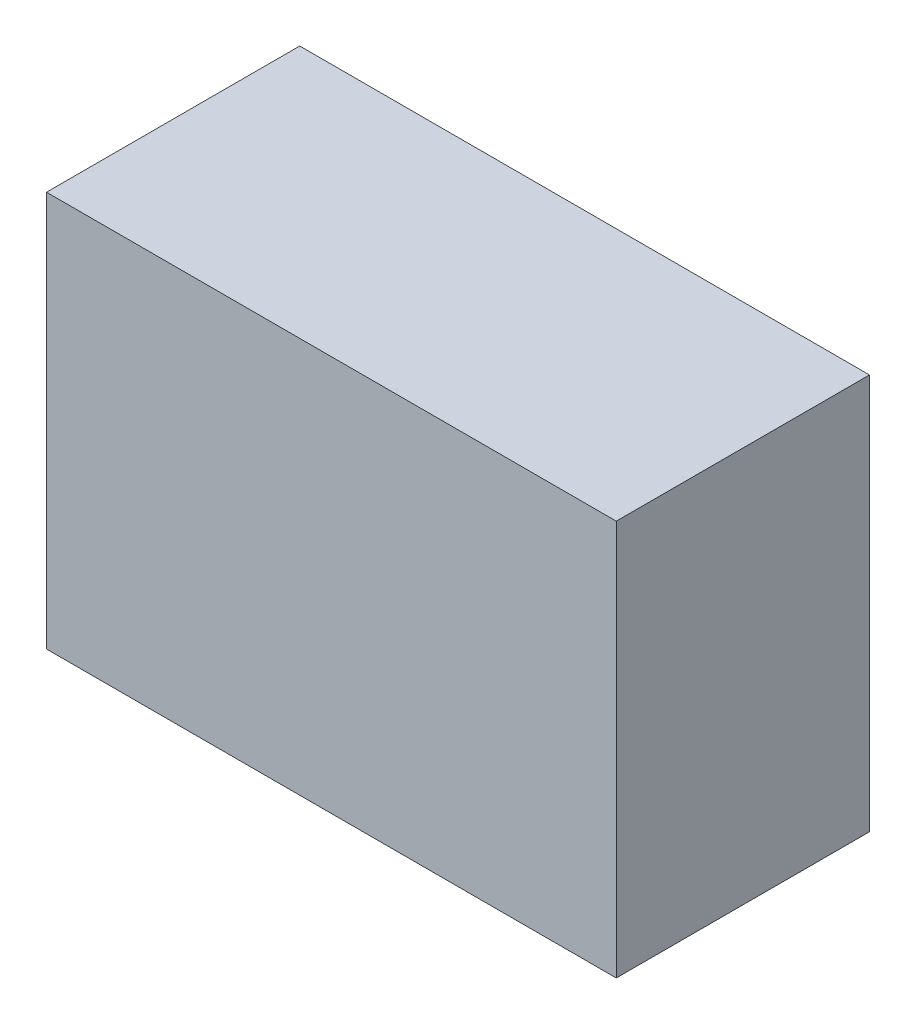
ISO-10303-21;
HEADER;
FILE_DESCRIPTION(('STEP AP214'),'2;1');
FILE_NAME('part.step','',(''),(''),'','','');
FILE_SCHEMA(('AUTOMOTIVE_DESIGN { 1 0 10303 214 1 1 1 1 }'));
ENDSEC;
DATA;
#1=APPLICATION_CONTEXT('core data for automotive mechanical design processes');
#2=APPLICATION_PROTOCOL_DEFINITION('international standard','automotive_design',2000,#1);
#3=PRODUCT_CONTEXT('',#1,'mechanical');
#4=PRODUCT('Part','Part','',(#3));
#5=PRODUCT_RELATED_PRODUCT_CATEGORY('part','',(#4));
#6=PRODUCT_DEFINITION_FORMATION('','',#4);
#7=PRODUCT_DEFINITION_CONTEXT('part definition',#1,'design');
#8=PRODUCT_DEFINITION('design','',#6,#7);
#9=PRODUCT_DEFINITION_SHAPE('','',#8);
#10=(LENGTH_UNIT() NAMED_UNIT(*) SI_UNIT(.MILLI.,.METRE.));
#11=(NAMED_UNIT(*) PLANE_ANGLE_UNIT() SI_UNIT($,.RADIAN.));
#12=(NAMED_UNIT(*) SI_UNIT($,.STERADIAN.) SOLID_ANGLE_UNIT());
#13=UNCERTAINTY_MEASURE_WITH_UNIT(LENGTH_MEASURE(1.E-05),#10,'distance_accuracy_value','');
#14=(GEOMETRIC_REPRESENTATION_CONTEXT(3) GLOBAL_UNCERTAINTY_ASSIGNED_CONTEXT((#13)) GLOBAL_UNIT_ASSIGNED_CONTEXT((#10,
#11,#12)) REPRESENTATION_CONTEXT('',''));
#15=CARTESIAN_POINT('',(0.,0.,0.));
#16=DIRECTION('',(0.,0.,1.));
#17=DIRECTION('',(1.,0.,0.));
#18=AXIS2_PLACEMENT_3D('',#15,#16,#17);
#19=CARTESIAN_POINT('',(-405.971326192233,-309.730519005755,203.2));
#20=DIRECTION('',(-1.,0.,0.));
#21=DIRECTION('',(0.,0.,1.));
#22=AXIS2_PLACEMENT_3D('',#19,#20,#21);
#23=PLANE('',#22);
#24=DIRECTION('',(0.,1.,0.));
#25=VECTOR('',#24,1.);
#26=CARTESIAN_POINT('',(-405.971326192233,-309.730519005755,0.));
#27=LINE('',#26,#25);
#28=CARTESIAN_POINT('',(-405.971326192233,-309.730519005755,0.));
#29=VERTEX_POINT('',#28);
#30=CARTESIAN_POINT('',(-405.971326192233,7.76948099424474,0.));
#31=VERTEX_POINT('',#30);
#32=EDGE_CURVE('E100',#29,#31,#27,.T.);
#33=ORIENTED_EDGE('',*,*,#32,.T.);
#34=DIRECTION('',(0.,0.,-1.));
#35=VECTOR('',#34,1.);
#36=CARTESIAN_POINT('',(-405.971326192233,7.76948099424474,203.2));
#37=LINE('',#36,#35);
#38=CARTESIAN_POINT('',(-405.971326192233,7.76948099424474,203.2));
#39=VERTEX_POINT('',#38);
#40=EDGE_CURVE('E11',#39,#31,#37,.T.);
#41=ORIENTED_EDGE('',*,*,#40,.F.);
#42=DIRECTION('',(0.,1.,0.));
#43=VECTOR('',#42,1.);
#44=CARTESIAN_POINT('',(-405.971326192233,-309.730519005755,203.2));
#45=LINE('',#44,#43);
#46=CARTESIAN_POINT('',(-405.971326192233,-309.730519005755,203.2));
#47=VERTEX_POINT('',#46);
#48=EDGE_CURVE('E88',#47,#39,#45,.T.);
#49=ORIENTED_EDGE('',*,*,#48,.F.);
#50=DIRECTION('',(0.,0.,-1.));
#51=VECTOR('',#50,1.);
#52=CARTESIAN_POINT('',(-405.971326192233,-309.730519005755,203.2));
#53=LINE('',#52,#51);
#54=EDGE_CURVE('E96',#47,#29,#53,.T.);
#55=ORIENTED_EDGE('',*,*,#54,.T.);
#56=EDGE_LOOP('',(#33,#41,#49,#55));
#57=FACE_BOUND('',#56,.T.);
#58=ADVANCED_FACE('F37',(#57),#23,.F.);
#59=CARTESIAN_POINT('',(-405.971326192233,7.76948099424474,203.2));
#60=DIRECTION('',(0.,-1.,0.));
#61=DIRECTION('',(1.,0.,0.));
#62=AXIS2_PLACEMENT_3D('',#59,#60,#61);
#63=PLANE('',#62);
#64=DIRECTION('',(-1.,0.,0.));
#65=VECTOR('',#64,1.);
#66=CARTESIAN_POINT('',(-405.971326192233,7.76948099424474,0.));
#67=LINE('',#66,#65);
#68=CARTESIAN_POINT('',(-863.171326192233,7.76948099424468,0.));
#69=VERTEX_POINT('',#68);
#70=EDGE_CURVE('E92',#31,#69,#67,.T.);
#71=ORIENTED_EDGE('',*,*,#70,.T.);
#72=DIRECTION('',(0.,0.,-1.));
#73=VECTOR('',#72,1.);
#74=CARTESIAN_POINT('',(-863.171326192233,7.76948099424468,203.2));
#75=LINE('',#74,#73);
#76=CARTESIAN_POINT('',(-863.171326192233,7.76948099424468,203.2));
#77=VERTEX_POINT('',#76);
#78=EDGE_CURVE('E45',#77,#69,#75,.T.);
#79=ORIENTED_EDGE('',*,*,#78,.F.);
#80=DIRECTION('',(-1.,0.,0.));
#81=VECTOR('',#80,1.);
#82=CARTESIAN_POINT('',(-405.971326192233,7.76948099424474,203.2));
#83=LINE('',#82,#81);
#84=EDGE_CURVE('E83',#39,#77,#83,.T.);
#85=ORIENTED_EDGE('',*,*,#84,.F.);
#86=ORIENTED_EDGE('',*,*,#40,.T.);
#87=EDGE_LOOP('',(#71,#79,#85,#86));
#88=FACE_BOUND('',#87,.T.);
#89=ADVANCED_FACE('F91',(#88),#63,.F.);
#90=CARTESIAN_POINT('',(-863.171326192233,-309.730519005755,203.2));
#91=DIRECTION('',(1.,0.,0.));
#92=DIRECTION('',(0.,0.,-1.));
#93=AXIS2_PLACEMENT_3D('',#90,#91,#92);
#94=PLANE('',#93);
#95=DIRECTION('',(0.,-1.,0.));
#96=VECTOR('',#95,1.);
#97=CARTESIAN_POINT('',(-863.171326192233,-309.730519005755,0.));
#98=LINE('',#97,#96);
#99=CARTESIAN_POINT('',(-863.171326192233,-309.730519005755,0.));
#100=VERTEX_POINT('',#99);
#101=EDGE_CURVE('E70',#69,#100,#98,.T.);
#102=ORIENTED_EDGE('',*,*,#101,.T.);
#103=DIRECTION('',(0.,0.,-1.));
#104=VECTOR('',#103,1.);
#105=CARTESIAN_POINT('',(-863.171326192233,-309.730519005755,203.2));
#106=LINE('',#105,#104);
#107=CARTESIAN_POINT('',(-863.171326192233,-309.730519005755,203.2));
#108=VERTEX_POINT('',#107);
#109=EDGE_CURVE('E93',#108,#100,#106,.T.);
#110=ORIENTED_EDGE('',*,*,#109,.F.);
#111=DIRECTION('',(0.,-1.,0.));
#112=VECTOR('',#111,1.);
#113=CARTESIAN_POINT('',(-863.171326192233,-309.730519005755,203.2));
#114=LINE('',#113,#112);
#115=EDGE_CURVE('E86',#77,#108,#114,.T.);
#116=ORIENTED_EDGE('',*,*,#115,.F.);
#117=ORIENTED_EDGE('',*,*,#78,.T.);
#118=EDGE_LOOP('',(#102,#110,#116,#117));
#119=FACE_BOUND('',#118,.T.);
#120=ADVANCED_FACE('F94',(#119),#94,.F.);
#121=CARTESIAN_POINT('',(-405.971326192233,-309.730519005755,203.2));
#122=DIRECTION('',(0.,1.,0.));
#123=DIRECTION('',(-1.,0.,0.));
#124=AXIS2_PLACEMENT_3D('',#121,#122,#123);
#125=PLANE('',#124);
#126=DIRECTION('',(1.,0.,0.));
#127=VECTOR('',#126,1.);
#128=CARTESIAN_POINT('',(-405.971326192233,-309.730519005755,0.));
#129=LINE('',#128,#127);
#130=EDGE_CURVE('E76',#100,#29,#129,.T.);
#131=ORIENTED_EDGE('',*,*,#130,.T.);
#132=ORIENTED_EDGE('',*,*,#54,.F.);
#133=DIRECTION('',(1.,0.,0.));
#134=VECTOR('',#133,1.);
#135=CARTESIAN_POINT('',(-405.971326192233,-309.730519005755,203.2));
#136=LINE('',#135,#134);
#137=EDGE_CURVE('E53',#108,#47,#136,.T.);
#138=ORIENTED_EDGE('',*,*,#137,.F.);
#139=ORIENTED_EDGE('',*,*,#109,.T.);
#140=EDGE_LOOP('',(#131,#132,#138,#139));
#141=FACE_BOUND('',#140,.T.);
#142=ADVANCED_FACE('F107',(#141),#125,.F.);
#143=CARTESIAN_POINT('',(0.,0.,203.2));
#144=DIRECTION('',(0.,0.,1.));
#145=DIRECTION('',(1.,0.,0.));
#146=AXIS2_PLACEMENT_3D('',#143,#144,#145);
#147=PLANE('',#146);
#148=ORIENTED_EDGE('',*,*,#48,.T.);
#149=ORIENTED_EDGE('',*,*,#84,.T.);
#150=ORIENTED_EDGE('',*,*,#115,.T.);
#151=ORIENTED_EDGE('',*,*,#137,.T.);
#152=EDGE_LOOP('',(#148,#149,#150,#151));
#153=FACE_BOUND('',#152,.T.);
#154=ADVANCED_FACE('F84',(#153),#147,.T.);
#155=CARTESIAN_POINT('',(0.,0.,0.));
#156=DIRECTION('',(0.,0.,1.));
#157=DIRECTION('',(1.,0.,0.));
#158=AXIS2_PLACEMENT_3D('',#155,#156,#157);
#159=PLANE('',#158);
#160=ORIENTED_EDGE('',*,*,#32,.F.);
#161=ORIENTED_EDGE('',*,*,#130,.F.);
#162=ORIENTED_EDGE('',*,*,#101,.F.);
#163=ORIENTED_EDGE('',*,*,#70,.F.);
#164=EDGE_LOOP('',(#160,#161,#162,#163));
#165=FACE_BOUND('',#164,.T.);
#166=ADVANCED_FACE('F110',(#165),#159,.F.);
#167=CLOSED_SHELL('',(#58,#89,#120,#142,#154,#166));
#168=MANIFOLD_SOLID_BREP('B2',#167);
#169=ADVANCED_BREP_SHAPE_REPRESENTATION('',(#18,#168),#14);
#170=SHAPE_DEFINITION_REPRESENTATION(#9,#169);
ENDSEC;
END-ISO-10303-21;
